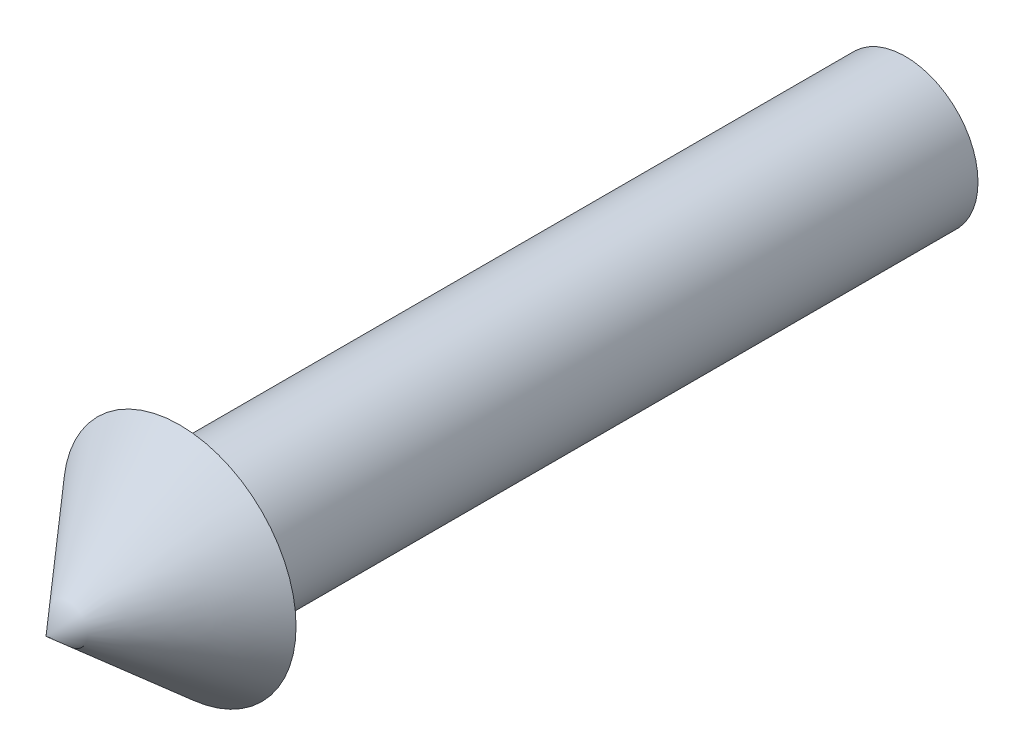
ISO-10303-21;
HEADER;
FILE_DESCRIPTION(('STEP AP214'),'2;1');
FILE_NAME('part.step','',(''),(''),'','','');
FILE_SCHEMA(('AUTOMOTIVE_DESIGN { 1 0 10303 214 1 1 1 1 }'));
ENDSEC;
DATA;
#1=APPLICATION_CONTEXT('core data for automotive mechanical design processes');
#2=APPLICATION_PROTOCOL_DEFINITION('international standard','automotive_design',2000,#1);
#3=PRODUCT_CONTEXT('',#1,'mechanical');
#4=PRODUCT('Part','Part','',(#3));
#5=PRODUCT_RELATED_PRODUCT_CATEGORY('part','',(#4));
#6=PRODUCT_DEFINITION_FORMATION('','',#4);
#7=PRODUCT_DEFINITION_CONTEXT('part definition',#1,'design');
#8=PRODUCT_DEFINITION('design','',#6,#7);
#9=PRODUCT_DEFINITION_SHAPE('','',#8);
#10=(LENGTH_UNIT() NAMED_UNIT(*) SI_UNIT(.MILLI.,.METRE.));
#11=(NAMED_UNIT(*) PLANE_ANGLE_UNIT() SI_UNIT($,.RADIAN.));
#12=(NAMED_UNIT(*) SI_UNIT($,.STERADIAN.) SOLID_ANGLE_UNIT());
#13=UNCERTAINTY_MEASURE_WITH_UNIT(LENGTH_MEASURE(1.E-05),#10,'distance_accuracy_value','');
#14=(GEOMETRIC_REPRESENTATION_CONTEXT(3) GLOBAL_UNCERTAINTY_ASSIGNED_CONTEXT((#13)) GLOBAL_UNIT_ASSIGNED_CONTEXT((#10,
#11,#12)) REPRESENTATION_CONTEXT('',''));
#15=CARTESIAN_POINT('',(0.,0.,0.));
#16=DIRECTION('',(0.,0.,1.));
#17=DIRECTION('',(1.,0.,0.));
#18=AXIS2_PLACEMENT_3D('',#15,#16,#17);
#19=CARTESIAN_POINT('',(0.,0.,200.));
#20=DIRECTION('',(0.,0.,-1.));
#21=DIRECTION('',(-1.,0.,0.));
#22=AXIS2_PLACEMENT_3D('',#19,#20,#21);
#23=CYLINDRICAL_SURFACE('',#22,20.);
#24=CARTESIAN_POINT('',(0.,0.,200.));
#25=DIRECTION('',(0.,0.,1.));
#26=DIRECTION('',(1.,0.,0.));
#27=AXIS2_PLACEMENT_3D('',#24,#25,#26);
#28=CIRCLE('',#27,20.);
#29=CARTESIAN_POINT('',(20.,0.,200.));
#30=VERTEX_POINT('',#29);
#31=EDGE_CURVE('E11',#30,#30,#28,.T.);
#32=ORIENTED_EDGE('',*,*,#31,.F.);
#33=EDGE_LOOP('',(#32));
#34=FACE_BOUND('',#33,.T.);
#35=CARTESIAN_POINT('',(0.,0.,0.));
#36=DIRECTION('',(0.,0.,1.));
#37=DIRECTION('',(1.,0.,0.));
#38=AXIS2_PLACEMENT_3D('',#35,#36,#37);
#39=CIRCLE('',#38,20.);
#40=CARTESIAN_POINT('',(20.,0.,0.));
#41=VERTEX_POINT('',#40);
#42=EDGE_CURVE('E37',#41,#41,#39,.T.);
#43=ORIENTED_EDGE('',*,*,#42,.T.);
#44=EDGE_LOOP('',(#43));
#45=FACE_BOUND('',#44,.T.);
#46=ADVANCED_FACE('F34',(#34,#45),#23,.T.);
#47=CARTESIAN_POINT('',(0.,0.,0.));
#48=DIRECTION('',(0.,0.,1.));
#49=DIRECTION('',(1.,0.,0.));
#50=AXIS2_PLACEMENT_3D('',#47,#48,#49);
#51=PLANE('',#50);
#52=ORIENTED_EDGE('',*,*,#42,.F.);
#53=EDGE_LOOP('',(#52));
#54=FACE_BOUND('',#53,.T.);
#55=ADVANCED_FACE('F47',(#54),#51,.F.);
#56=CARTESIAN_POINT('',(0.,0.,200.));
#57=DIRECTION('',(0.,0.,-1.));
#58=DIRECTION('',(-1.,0.,0.));
#59=AXIS2_PLACEMENT_3D('',#56,#57,#58);
#60=CONICAL_SURFACE('',#59,32.0568002143671,0.715812542162807);
#61=CARTESIAN_POINT('',(0.,0.,236.860187008098));
#62=VERTEX_POINT('',#61);
#63=VERTEX_LOOP('',#62);
#64=FACE_BOUND('',#63,.T.);
#65=CARTESIAN_POINT('',(0.,0.,200.));
#66=DIRECTION('',(0.,0.,-1.));
#67=DIRECTION('',(-1.,0.,0.));
#68=AXIS2_PLACEMENT_3D('',#65,#66,#67);
#69=CIRCLE('',#68,32.0568002143671);
#70=CARTESIAN_POINT('',(-32.0568002143671,0.,200.));
#71=VERTEX_POINT('',#70);
#72=EDGE_CURVE('E51',#71,#71,#69,.T.);
#73=ORIENTED_EDGE('',*,*,#72,.F.);
#74=EDGE_LOOP('',(#73));
#75=FACE_BOUND('',#74,.T.);
#76=ADVANCED_FACE('F43',(#64,#75),#60,.T.);
#77=CARTESIAN_POINT('',(0.,32.0568002143671,200.));
#78=DIRECTION('',(0.,0.,-1.));
#79=DIRECTION('',(-1.,0.,0.));
#80=AXIS2_PLACEMENT_3D('',#77,#78,#79);
#81=PLANE('',#80);
#82=ORIENTED_EDGE('',*,*,#31,.T.);
#83=EDGE_LOOP('',(#82));
#84=FACE_BOUND('',#83,.T.);
#85=ORIENTED_EDGE('',*,*,#72,.T.);
#86=EDGE_LOOP('',(#85));
#87=FACE_BOUND('',#86,.T.);
#88=ADVANCED_FACE('F46',(#84,#87),#81,.T.);
#89=CLOSED_SHELL('',(#46,#55,#76,#88));
#90=MANIFOLD_SOLID_BREP('B2',#89);
#91=ADVANCED_BREP_SHAPE_REPRESENTATION('',(#18,#90),#14);
#92=SHAPE_DEFINITION_REPRESENTATION(#9,#91);
ENDSEC;
END-ISO-10303-21;
